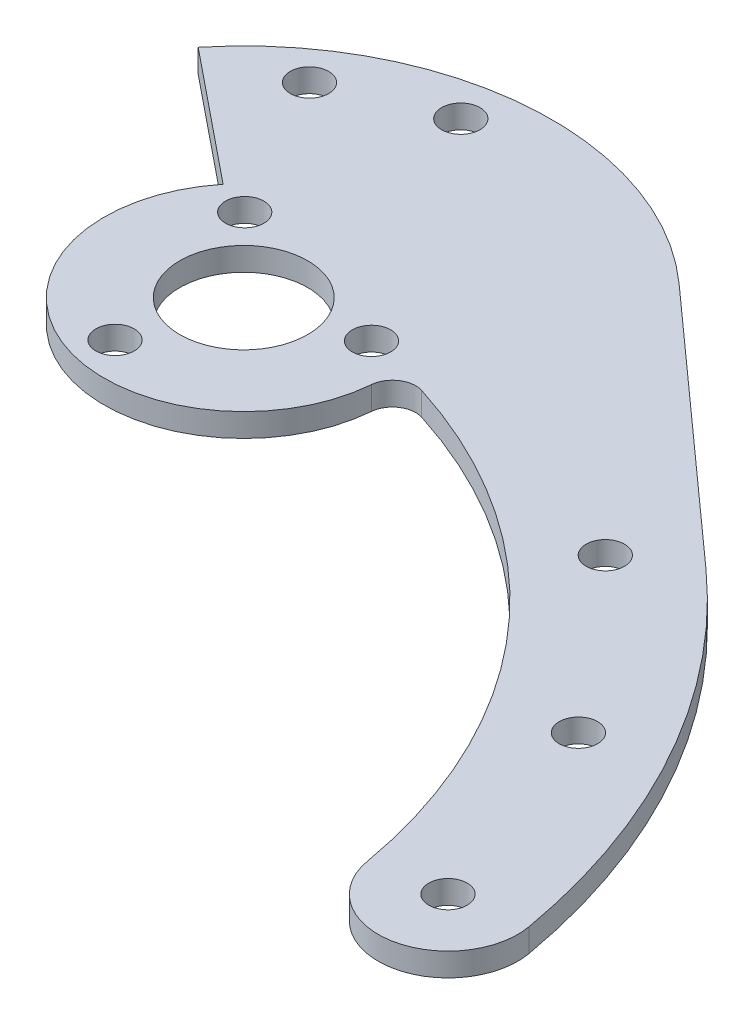
ISO-10303-21;
HEADER;
FILE_DESCRIPTION(('STEP AP214'),'2;1');
FILE_NAME('part.step','',(''),(''),'','','');
FILE_SCHEMA(('AUTOMOTIVE_DESIGN { 1 0 10303 214 1 1 1 1 }'));
ENDSEC;
DATA;
#1=APPLICATION_CONTEXT('core data for automotive mechanical design processes');
#2=APPLICATION_PROTOCOL_DEFINITION('international standard','automotive_design',2000,#1);
#3=PRODUCT_CONTEXT('',#1,'mechanical');
#4=PRODUCT('Part','Part','',(#3));
#5=PRODUCT_RELATED_PRODUCT_CATEGORY('part','',(#4));
#6=PRODUCT_DEFINITION_FORMATION('','',#4);
#7=PRODUCT_DEFINITION_CONTEXT('part definition',#1,'design');
#8=PRODUCT_DEFINITION('design','',#6,#7);
#9=PRODUCT_DEFINITION_SHAPE('','',#8);
#10=(LENGTH_UNIT() NAMED_UNIT(*) SI_UNIT(.MILLI.,.METRE.));
#11=(NAMED_UNIT(*) PLANE_ANGLE_UNIT() SI_UNIT($,.RADIAN.));
#12=(NAMED_UNIT(*) SI_UNIT($,.STERADIAN.) SOLID_ANGLE_UNIT());
#13=UNCERTAINTY_MEASURE_WITH_UNIT(LENGTH_MEASURE(1.E-05),#10,'distance_accuracy_value','');
#14=(GEOMETRIC_REPRESENTATION_CONTEXT(3) GLOBAL_UNCERTAINTY_ASSIGNED_CONTEXT((#13)) GLOBAL_UNIT_ASSIGNED_CONTEXT((#10,
#11,#12)) REPRESENTATION_CONTEXT('',''));
#15=CARTESIAN_POINT('',(0.,0.,0.));
#16=DIRECTION('',(0.,0.,1.));
#17=DIRECTION('',(1.,0.,0.));
#18=AXIS2_PLACEMENT_3D('',#15,#16,#17);
#19=CARTESIAN_POINT('',(0.,2.,0.));
#20=DIRECTION('',(0.,-1.,0.));
#21=DIRECTION('',(0.,0.,-1.));
#22=AXIS2_PLACEMENT_3D('',#19,#20,#21);
#23=PLANE('',#22);
#24=CARTESIAN_POINT('',(34.7105309230729,2.,3.63360007157498));
#25=DIRECTION('',(0.,1.,0.));
#26=DIRECTION('',(0.,0.,1.));
#27=AXIS2_PLACEMENT_3D('',#24,#25,#26);
#28=CIRCLE('',#27,1.65);
#29=CARTESIAN_POINT('',(34.7105309230729,2.,5.28360007157498));
#30=VERTEX_POINT('',#29);
#31=EDGE_CURVE('E379',#30,#30,#28,.T.);
#32=ORIENTED_EDGE('',*,*,#31,.F.);
#33=EDGE_LOOP('',(#32));
#34=FACE_BOUND('',#33,.T.);
#35=CARTESIAN_POINT('',(53.1796186626592,2.,35.6229984059855));
#36=DIRECTION('',(0.,1.,0.));
#37=DIRECTION('',(0.,0.,1.));
#38=AXIS2_PLACEMENT_3D('',#35,#36,#37);
#39=CIRCLE('',#38,1.65);
#40=CARTESIAN_POINT('',(53.1796186626592,2.,37.2729984059855));
#41=VERTEX_POINT('',#40);
#42=EDGE_CURVE('E373',#41,#41,#39,.T.);
#43=ORIENTED_EDGE('',*,*,#42,.F.);
#44=EDGE_LOOP('',(#43));
#45=FACE_BOUND('',#44,.T.);
#46=CARTESIAN_POINT('',(46.7653718043596,2.,17.9999999999998));
#47=DIRECTION('',(0.,1.,0.));
#48=DIRECTION('',(0.,0.,1.));
#49=AXIS2_PLACEMENT_3D('',#46,#47,#48);
#50=CIRCLE('',#49,1.64999999999999);
#51=CARTESIAN_POINT('',(46.7653718043596,2.,19.6499999999998));
#52=VERTEX_POINT('',#51);
#53=EDGE_CURVE('E376',#52,#52,#50,.T.);
#54=ORIENTED_EDGE('',*,*,#53,.F.);
#55=EDGE_LOOP('',(#54));
#56=FACE_BOUND('',#55,.T.);
#57=CARTESIAN_POINT('',(-13.1922580360741,2.,-18.8404970186468));
#58=DIRECTION('',(0.,1.,0.));
#59=DIRECTION('',(0.,0.,-1.));
#60=AXIS2_PLACEMENT_3D('',#57,#58,#59);
#61=CIRCLE('',#60,1.65);
#62=CARTESIAN_POINT('',(-13.1922580360741,2.,-20.4904970186468));
#63=VERTEX_POINT('',#62);
#64=EDGE_CURVE('E388',#63,#63,#61,.T.);
#65=ORIENTED_EDGE('',*,*,#64,.F.);
#66=EDGE_LOOP('',(#65));
#67=FACE_BOUND('',#66,.T.);
#68=CARTESIAN_POINT('',(-3.99390808633942,2.,-22.6505783192808));
#69=DIRECTION('',(0.,1.,0.));
#70=DIRECTION('',(0.,0.,1.));
#71=AXIS2_PLACEMENT_3D('',#68,#69,#70);
#72=CIRCLE('',#71,1.65);
#73=CARTESIAN_POINT('',(-3.99390808633942,2.,-21.0005783192808));
#74=VERTEX_POINT('',#73);
#75=EDGE_CURVE('E387',#74,#74,#72,.T.);
#76=ORIENTED_EDGE('',*,*,#75,.F.);
#77=EDGE_LOOP('',(#76));
#78=FACE_BOUND('',#77,.T.);
#79=CARTESIAN_POINT('',(0.,2.,0.));
#80=DIRECTION('',(0.,1.,0.));
#81=DIRECTION('',(0.,0.,-1.));
#82=AXIS2_PLACEMENT_3D('',#79,#80,#81);
#83=CIRCLE('',#82,26.5);
#84=CARTESIAN_POINT('',(17.6931753318826,2.,-19.728191672712));
#85=VERTEX_POINT('',#84);
#86=CARTESIAN_POINT('',(-20.5943679786096,2.,-16.6769903628208));
#87=VERTEX_POINT('',#86);
#88=EDGE_CURVE('E105',#85,#87,#83,.T.);
#89=ORIENTED_EDGE('',*,*,#88,.T.);
#90=DIRECTION('',(0.777145961456968,0.,0.629320391049841));
#91=VECTOR('',#90,1.);
#92=CARTESIAN_POINT('',(-9.32575153748363,2.,-7.55184469259811));
#93=LINE('',#92,#91);
#94=CARTESIAN_POINT('',(-9.32575153748362,2.,-7.55184469259812));
#95=VERTEX_POINT('',#94);
#96=EDGE_CURVE('E109',#87,#95,#93,.T.);
#97=ORIENTED_EDGE('',*,*,#96,.T.);
#98=CARTESIAN_POINT('',(0.,2.,0.));
#99=DIRECTION('',(0.,1.,0.));
#100=DIRECTION('',(0.,0.,1.));
#101=AXIS2_PLACEMENT_3D('',#98,#99,#100);
#102=CIRCLE('',#101,12.);
#103=CARTESIAN_POINT('',(11.9583266338679,2.,0.999211748192564));
#104=VERTEX_POINT('',#103);
#105=EDGE_CURVE('E129',#95,#104,#102,.T.);
#106=ORIENTED_EDGE('',*,*,#105,.T.);
#107=CARTESIAN_POINT('',(13.9513810728459,2.,1.16574703955799));
#108=DIRECTION('',(0.,-1.,0.));
#109=DIRECTION('',(0.,0.,-1.));
#110=AXIS2_PLACEMENT_3D('',#107,#108,#109);
#111=CIRCLE('',#110,2.);
#112=CARTESIAN_POINT('',(14.5579628586218,2.,-0.740048998103156));
#113=VERTEX_POINT('',#112);
#114=EDGE_CURVE('E11',#104,#113,#111,.T.);
#115=ORIENTED_EDGE('',*,*,#114,.T.);
#116=CARTESIAN_POINT('',(0.,2.,44.9990559057643));
#117=DIRECTION('',(0.,-1.,0.));
#118=DIRECTION('',(0.,0.,1.));
#119=AXIS2_PLACEMENT_3D('',#116,#117,#118);
#120=CIRCLE('',#119,48.);
#121=CARTESIAN_POINT('',(47.270772144586,2.,36.6639433777517));
#122=VERTEX_POINT('',#121);
#123=EDGE_CURVE('E131',#113,#122,#120,.T.);
#124=ORIENTED_EDGE('',*,*,#123,.T.);
#125=CARTESIAN_POINT('',(53.1796186626593,2.,35.6220543117502));
#126=DIRECTION('',(0.,1.,0.));
#127=DIRECTION('',(0.,0.,-1.));
#128=AXIS2_PLACEMENT_3D('',#125,#126,#127);
#129=CIRCLE('',#128,6.);
#130=CARTESIAN_POINT('',(59.0884651807325,2.,34.5801652457486));
#131=VERTEX_POINT('',#130);
#132=EDGE_CURVE('E136',#122,#131,#129,.T.);
#133=ORIENTED_EDGE('',*,*,#132,.T.);
#134=CARTESIAN_POINT('',(0.,2.,44.9990559057643));
#135=DIRECTION('',(0.,1.,0.));
#136=DIRECTION('',(0.,0.,-1.));
#137=AXIS2_PLACEMENT_3D('',#134,#135,#136);
#138=CIRCLE('',#137,60.);
#139=CARTESIAN_POINT('',(40.0600196193567,2.,0.33145211849181));
#140=VERTEX_POINT('',#139);
#141=EDGE_CURVE('E138',#131,#140,#138,.T.);
#142=ORIENTED_EDGE('',*,*,#141,.T.);
#143=DIRECTION('',(-0.744460063121208,0.,-0.667666993655945));
#144=VECTOR('',#143,1.);
#145=CARTESIAN_POINT('',(40.0600196193567,2.,0.33145211849181));
#146=LINE('',#145,#144);
#147=EDGE_CURVE('E112',#140,#85,#146,.T.);
#148=ORIENTED_EDGE('',*,*,#147,.T.);
#149=EDGE_LOOP('',(#89,#97,#106,#115,#124,#133,#142,#148));
#150=FACE_BOUND('',#149,.T.);
#151=CARTESIAN_POINT('',(0.,2.,0.));
#152=DIRECTION('',(0.,1.,0.));
#153=DIRECTION('',(0.,0.,1.));
#154=AXIS2_PLACEMENT_3D('',#151,#152,#153);
#155=CIRCLE('',#154,5.5);
#156=CARTESIAN_POINT('',(0.,2.,5.5));
#157=VERTEX_POINT('',#156);
#158=EDGE_CURVE('E144',#157,#157,#155,.T.);
#159=ORIENTED_EDGE('',*,*,#158,.F.);
#160=EDGE_LOOP('',(#159));
#161=FACE_BOUND('',#160,.T.);
#162=CARTESIAN_POINT('',(-6.32260432068822,2.,-6.40505071049517));
#163=DIRECTION('',(0.,1.,0.));
#164=DIRECTION('',(0.,0.,1.));
#165=AXIS2_PLACEMENT_3D('',#162,#163,#164);
#166=CIRCLE('',#165,1.65);
#167=CARTESIAN_POINT('',(-6.32260432068822,2.,-4.75505071049517));
#168=VERTEX_POINT('',#167);
#169=EDGE_CURVE('E414',#168,#168,#166,.T.);
#170=ORIENTED_EDGE('',*,*,#169,.F.);
#171=EDGE_LOOP('',(#170));
#172=FACE_BOUND('',#171,.T.);
#173=CARTESIAN_POINT('',(8.70823878816048,2.,-2.27301060454571));
#174=DIRECTION('',(0.,1.,0.));
#175=DIRECTION('',(0.,0.,1.));
#176=AXIS2_PLACEMENT_3D('',#173,#174,#175);
#177=CIRCLE('',#176,1.65);
#178=CARTESIAN_POINT('',(8.70823878816048,2.,-0.623010604545705));
#179=VERTEX_POINT('',#178);
#180=EDGE_CURVE('E408',#179,#179,#177,.T.);
#181=ORIENTED_EDGE('',*,*,#180,.F.);
#182=EDGE_LOOP('',(#181));
#183=FACE_BOUND('',#182,.T.);
#184=CARTESIAN_POINT('',(-2.38563446747228,2.,8.67806131504083));
#185=DIRECTION('',(0.,1.,0.));
#186=DIRECTION('',(0.,0.,1.));
#187=AXIS2_PLACEMENT_3D('',#184,#185,#186);
#188=CIRCLE('',#187,1.65);
#189=CARTESIAN_POINT('',(-2.38563446747228,2.,10.3280613150408));
#190=VERTEX_POINT('',#189);
#191=EDGE_CURVE('E402',#190,#190,#188,.T.);
#192=ORIENTED_EDGE('',*,*,#191,.F.);
#193=EDGE_LOOP('',(#192));
#194=FACE_BOUND('',#193,.T.);
#195=ADVANCED_FACE('F41',(#34,#45,#56,#67,#78,#150,#161,#172,#183,#194),#23,.F.);
#196=CARTESIAN_POINT('',(0.,0.,0.));
#197=DIRECTION('',(0.,-1.,0.));
#198=DIRECTION('',(0.,0.,-1.));
#199=AXIS2_PLACEMENT_3D('',#196,#197,#198);
#200=PLANE('',#199);
#201=CARTESIAN_POINT('',(34.7105309230729,0.,3.63360007157498));
#202=DIRECTION('',(0.,1.,0.));
#203=DIRECTION('',(0.,0.,1.));
#204=AXIS2_PLACEMENT_3D('',#201,#202,#203);
#205=CIRCLE('',#204,1.65);
#206=CARTESIAN_POINT('',(34.7105309230729,0.,5.28360007157498));
#207=VERTEX_POINT('',#206);
#208=EDGE_CURVE('E374',#207,#207,#205,.T.);
#209=ORIENTED_EDGE('',*,*,#208,.T.);
#210=EDGE_LOOP('',(#209));
#211=FACE_BOUND('',#210,.T.);
#212=CARTESIAN_POINT('',(53.1796186626592,0.,35.6229984059855));
#213=DIRECTION('',(0.,1.,0.));
#214=DIRECTION('',(0.,0.,1.));
#215=AXIS2_PLACEMENT_3D('',#212,#213,#214);
#216=CIRCLE('',#215,1.65);
#217=CARTESIAN_POINT('',(53.1796186626592,0.,37.2729984059855));
#218=VERTEX_POINT('',#217);
#219=EDGE_CURVE('E370',#218,#218,#216,.T.);
#220=ORIENTED_EDGE('',*,*,#219,.T.);
#221=EDGE_LOOP('',(#220));
#222=FACE_BOUND('',#221,.T.);
#223=CARTESIAN_POINT('',(46.7653718043596,0.,17.9999999999998));
#224=DIRECTION('',(0.,1.,0.));
#225=DIRECTION('',(0.,0.,1.));
#226=AXIS2_PLACEMENT_3D('',#223,#224,#225);
#227=CIRCLE('',#226,1.64999999999999);
#228=CARTESIAN_POINT('',(46.7653718043596,0.,19.6499999999998));
#229=VERTEX_POINT('',#228);
#230=EDGE_CURVE('E391',#229,#229,#227,.T.);
#231=ORIENTED_EDGE('',*,*,#230,.T.);
#232=EDGE_LOOP('',(#231));
#233=FACE_BOUND('',#232,.T.);
#234=CARTESIAN_POINT('',(-13.1922580360741,0.,-18.8404970186468));
#235=DIRECTION('',(0.,1.,0.));
#236=DIRECTION('',(0.,0.,-1.));
#237=AXIS2_PLACEMENT_3D('',#234,#235,#236);
#238=CIRCLE('',#237,1.65);
#239=CARTESIAN_POINT('',(-13.1922580360741,0.,-20.4904970186468));
#240=VERTEX_POINT('',#239);
#241=EDGE_CURVE('E384',#240,#240,#238,.T.);
#242=ORIENTED_EDGE('',*,*,#241,.T.);
#243=EDGE_LOOP('',(#242));
#244=FACE_BOUND('',#243,.T.);
#245=CARTESIAN_POINT('',(-3.99390808633942,0.,-22.6505783192808));
#246=DIRECTION('',(0.,1.,0.));
#247=DIRECTION('',(0.,0.,1.));
#248=AXIS2_PLACEMENT_3D('',#245,#246,#247);
#249=CIRCLE('',#248,1.65);
#250=CARTESIAN_POINT('',(-3.99390808633942,0.,-21.0005783192808));
#251=VERTEX_POINT('',#250);
#252=EDGE_CURVE('E396',#251,#251,#249,.T.);
#253=ORIENTED_EDGE('',*,*,#252,.T.);
#254=EDGE_LOOP('',(#253));
#255=FACE_BOUND('',#254,.T.);
#256=CARTESIAN_POINT('',(8.70823878816048,0.,-2.27301060454571));
#257=DIRECTION('',(0.,1.,0.));
#258=DIRECTION('',(0.,0.,1.));
#259=AXIS2_PLACEMENT_3D('',#256,#257,#258);
#260=CIRCLE('',#259,1.65);
#261=CARTESIAN_POINT('',(8.70823878816048,0.,-0.623010604545705));
#262=VERTEX_POINT('',#261);
#263=EDGE_CURVE('E405',#262,#262,#260,.T.);
#264=ORIENTED_EDGE('',*,*,#263,.T.);
#265=EDGE_LOOP('',(#264));
#266=FACE_BOUND('',#265,.T.);
#267=CARTESIAN_POINT('',(0.,0.,0.));
#268=DIRECTION('',(0.,1.,0.));
#269=DIRECTION('',(0.,0.,1.));
#270=AXIS2_PLACEMENT_3D('',#267,#268,#269);
#271=CIRCLE('',#270,5.5);
#272=CARTESIAN_POINT('',(0.,0.,5.5));
#273=VERTEX_POINT('',#272);
#274=EDGE_CURVE('E417',#273,#273,#271,.T.);
#275=ORIENTED_EDGE('',*,*,#274,.T.);
#276=EDGE_LOOP('',(#275));
#277=FACE_BOUND('',#276,.T.);
#278=CARTESIAN_POINT('',(0.,0.,0.));
#279=DIRECTION('',(0.,1.,0.));
#280=DIRECTION('',(0.,0.,1.));
#281=AXIS2_PLACEMENT_3D('',#278,#279,#280);
#282=CIRCLE('',#281,26.5);
#283=CARTESIAN_POINT('',(17.6931753318826,0.,-19.728191672712));
#284=VERTEX_POINT('',#283);
#285=CARTESIAN_POINT('',(-20.5943679786096,0.,-16.6769903628208));
#286=VERTEX_POINT('',#285);
#287=EDGE_CURVE('E121',#284,#286,#282,.T.);
#288=ORIENTED_EDGE('',*,*,#287,.F.);
#289=DIRECTION('',(-0.744460063121208,0.,-0.667666993655945));
#290=VECTOR('',#289,1.);
#291=CARTESIAN_POINT('',(40.0600196193567,0.,0.33145211849181));
#292=LINE('',#291,#290);
#293=CARTESIAN_POINT('',(40.0600196193567,0.,0.33145211849181));
#294=VERTEX_POINT('',#293);
#295=EDGE_CURVE('E116',#294,#284,#292,.T.);
#296=ORIENTED_EDGE('',*,*,#295,.F.);
#297=CARTESIAN_POINT('',(0.,0.,44.9990559057643));
#298=DIRECTION('',(0.,1.,0.));
#299=DIRECTION('',(0.,0.,-1.));
#300=AXIS2_PLACEMENT_3D('',#297,#298,#299);
#301=CIRCLE('',#300,60.);
#302=CARTESIAN_POINT('',(59.0884651807325,0.,34.5801652457486));
#303=VERTEX_POINT('',#302);
#304=EDGE_CURVE('E152',#303,#294,#301,.T.);
#305=ORIENTED_EDGE('',*,*,#304,.F.);
#306=CARTESIAN_POINT('',(53.1796186626593,0.,35.6220543117502));
#307=DIRECTION('',(0.,1.,0.));
#308=DIRECTION('',(0.,0.,-1.));
#309=AXIS2_PLACEMENT_3D('',#306,#307,#308);
#310=CIRCLE('',#309,6.);
#311=CARTESIAN_POINT('',(47.270772144586,0.,36.6639433777517));
#312=VERTEX_POINT('',#311);
#313=EDGE_CURVE('E150',#312,#303,#310,.T.);
#314=ORIENTED_EDGE('',*,*,#313,.F.);
#315=CARTESIAN_POINT('',(0.,0.,44.9990559057643));
#316=DIRECTION('',(0.,-1.,0.));
#317=DIRECTION('',(0.,0.,1.));
#318=AXIS2_PLACEMENT_3D('',#315,#316,#317);
#319=CIRCLE('',#318,48.);
#320=CARTESIAN_POINT('',(14.5579628586218,0.,-0.740048998103156));
#321=VERTEX_POINT('',#320);
#322=EDGE_CURVE('E148',#321,#312,#319,.T.);
#323=ORIENTED_EDGE('',*,*,#322,.F.);
#324=CARTESIAN_POINT('',(13.9513810728459,0.,1.16574703955799));
#325=DIRECTION('',(0.,-1.,0.));
#326=DIRECTION('',(0.,0.,-1.));
#327=AXIS2_PLACEMENT_3D('',#324,#325,#326);
#328=CIRCLE('',#327,2.);
#329=CARTESIAN_POINT('',(11.9583266338679,0.,0.999211748192564));
#330=VERTEX_POINT('',#329);
#331=EDGE_CURVE('E49',#321,#330,#328,.F.);
#332=ORIENTED_EDGE('',*,*,#331,.T.);
#333=CARTESIAN_POINT('',(0.,0.,0.));
#334=DIRECTION('',(0.,1.,0.));
#335=DIRECTION('',(0.,0.,1.));
#336=AXIS2_PLACEMENT_3D('',#333,#334,#335);
#337=CIRCLE('',#336,12.);
#338=CARTESIAN_POINT('',(-9.32575153748362,0.,-7.55184469259812));
#339=VERTEX_POINT('',#338);
#340=EDGE_CURVE('E146',#339,#330,#337,.T.);
#341=ORIENTED_EDGE('',*,*,#340,.F.);
#342=DIRECTION('',(0.777145961456968,0.,0.629320391049841));
#343=VECTOR('',#342,1.);
#344=CARTESIAN_POINT('',(-9.32575153748363,0.,-7.55184469259811));
#345=LINE('',#344,#343);
#346=EDGE_CURVE('E143',#286,#339,#345,.T.);
#347=ORIENTED_EDGE('',*,*,#346,.F.);
#348=EDGE_LOOP('',(#288,#296,#305,#314,#323,#332,#341,#347));
#349=FACE_BOUND('',#348,.T.);
#350=CARTESIAN_POINT('',(-6.32260432068822,0.,-6.40505071049517));
#351=DIRECTION('',(0.,1.,0.));
#352=DIRECTION('',(0.,0.,1.));
#353=AXIS2_PLACEMENT_3D('',#350,#351,#352);
#354=CIRCLE('',#353,1.65);
#355=CARTESIAN_POINT('',(-6.32260432068822,0.,-4.75505071049517));
#356=VERTEX_POINT('',#355);
#357=EDGE_CURVE('E411',#356,#356,#354,.T.);
#358=ORIENTED_EDGE('',*,*,#357,.T.);
#359=EDGE_LOOP('',(#358));
#360=FACE_BOUND('',#359,.T.);
#361=CARTESIAN_POINT('',(-2.38563446747228,0.,8.67806131504083));
#362=DIRECTION('',(0.,1.,0.));
#363=DIRECTION('',(0.,0.,1.));
#364=AXIS2_PLACEMENT_3D('',#361,#362,#363);
#365=CIRCLE('',#364,1.65);
#366=CARTESIAN_POINT('',(-2.38563446747228,0.,10.3280613150408));
#367=VERTEX_POINT('',#366);
#368=EDGE_CURVE('E399',#367,#367,#365,.T.);
#369=ORIENTED_EDGE('',*,*,#368,.T.);
#370=EDGE_LOOP('',(#369));
#371=FACE_BOUND('',#370,.T.);
#372=ADVANCED_FACE('F177',(#211,#222,#233,#244,#255,#266,#277,#349,#360,#371),#200,.T.);
#373=CARTESIAN_POINT('',(0.,2.,0.));
#374=DIRECTION('',(0.,-1.,0.));
#375=DIRECTION('',(0.,0.,-1.));
#376=AXIS2_PLACEMENT_3D('',#373,#374,#375);
#377=CYLINDRICAL_SURFACE('',#376,26.5);
#378=ORIENTED_EDGE('',*,*,#287,.T.);
#379=DIRECTION('',(0.,-1.,0.));
#380=VECTOR('',#379,1.);
#381=CARTESIAN_POINT('',(-20.5943679786096,2.,-16.6769903628208));
#382=LINE('',#381,#380);
#383=EDGE_CURVE('E119',#87,#286,#382,.T.);
#384=ORIENTED_EDGE('',*,*,#383,.F.);
#385=ORIENTED_EDGE('',*,*,#88,.F.);
#386=DIRECTION('',(0.,-1.,0.));
#387=VECTOR('',#386,1.);
#388=CARTESIAN_POINT('',(17.6931753318826,2.,-19.728191672712));
#389=LINE('',#388,#387);
#390=EDGE_CURVE('E141',#85,#284,#389,.T.);
#391=ORIENTED_EDGE('',*,*,#390,.T.);
#392=EDGE_LOOP('',(#378,#384,#385,#391));
#393=FACE_BOUND('',#392,.T.);
#394=ADVANCED_FACE('F120',(#393),#377,.T.);
#395=CARTESIAN_POINT('',(-9.32575153748363,2.,-7.55184469259811));
#396=DIRECTION('',(0.629320391049841,0.,-0.777145961456968));
#397=DIRECTION('',(-0.777145961456968,0.,-0.629320391049841));
#398=AXIS2_PLACEMENT_3D('',#395,#396,#397);
#399=PLANE('',#398);
#400=ORIENTED_EDGE('',*,*,#346,.T.);
#401=DIRECTION('',(0.,-1.,0.));
#402=VECTOR('',#401,1.);
#403=CARTESIAN_POINT('',(-9.32575153748362,2.,-7.55184469259812));
#404=LINE('',#403,#402);
#405=EDGE_CURVE('E125',#95,#339,#404,.T.);
#406=ORIENTED_EDGE('',*,*,#405,.F.);
#407=ORIENTED_EDGE('',*,*,#96,.F.);
#408=ORIENTED_EDGE('',*,*,#383,.T.);
#409=EDGE_LOOP('',(#400,#406,#407,#408));
#410=FACE_BOUND('',#409,.T.);
#411=ADVANCED_FACE('F127',(#410),#399,.F.);
#412=CARTESIAN_POINT('',(0.,2.,0.));
#413=DIRECTION('',(0.,-1.,0.));
#414=DIRECTION('',(0.,0.,-1.));
#415=AXIS2_PLACEMENT_3D('',#412,#413,#414);
#416=CYLINDRICAL_SURFACE('',#415,12.);
#417=ORIENTED_EDGE('',*,*,#340,.T.);
#418=DIRECTION('',(0.,-1.,0.));
#419=VECTOR('',#418,1.);
#420=CARTESIAN_POINT('',(11.9583266338679,2.,0.999211748192564));
#421=LINE('',#420,#419);
#422=EDGE_CURVE('E56',#330,#104,#421,.F.);
#423=ORIENTED_EDGE('',*,*,#422,.T.);
#424=ORIENTED_EDGE('',*,*,#105,.F.);
#425=ORIENTED_EDGE('',*,*,#405,.T.);
#426=EDGE_LOOP('',(#417,#423,#424,#425));
#427=FACE_BOUND('',#426,.T.);
#428=ADVANCED_FACE('F221',(#427),#416,.T.);
#429=CARTESIAN_POINT('',(0.,2.,44.9990559057643));
#430=DIRECTION('',(0.,-1.,0.));
#431=DIRECTION('',(0.,0.,-1.));
#432=AXIS2_PLACEMENT_3D('',#429,#430,#431);
#433=CYLINDRICAL_SURFACE('',#432,48.);
#434=ORIENTED_EDGE('',*,*,#123,.F.);
#435=DIRECTION('',(0.,-1.,0.));
#436=VECTOR('',#435,1.);
#437=CARTESIAN_POINT('',(14.5579628586218,2.,-0.740048998103163));
#438=LINE('',#437,#436);
#439=EDGE_CURVE('E124',#113,#321,#438,.T.);
#440=ORIENTED_EDGE('',*,*,#439,.T.);
#441=ORIENTED_EDGE('',*,*,#322,.T.);
#442=DIRECTION('',(0.,-1.,0.));
#443=VECTOR('',#442,1.);
#444=CARTESIAN_POINT('',(47.270772144586,2.,36.6639433777517));
#445=LINE('',#444,#443);
#446=EDGE_CURVE('E163',#122,#312,#445,.T.);
#447=ORIENTED_EDGE('',*,*,#446,.F.);
#448=EDGE_LOOP('',(#434,#440,#441,#447));
#449=FACE_BOUND('',#448,.T.);
#450=ADVANCED_FACE('F172',(#449),#433,.F.);
#451=CARTESIAN_POINT('',(53.1796186626593,2.,35.6220543117502));
#452=DIRECTION('',(0.,-1.,0.));
#453=DIRECTION('',(0.,0.,-1.));
#454=AXIS2_PLACEMENT_3D('',#451,#452,#453);
#455=CYLINDRICAL_SURFACE('',#454,6.);
#456=ORIENTED_EDGE('',*,*,#313,.T.);
#457=DIRECTION('',(0.,-1.,0.));
#458=VECTOR('',#457,1.);
#459=CARTESIAN_POINT('',(59.0884651807325,2.,34.5801652457486));
#460=LINE('',#459,#458);
#461=EDGE_CURVE('E160',#131,#303,#460,.T.);
#462=ORIENTED_EDGE('',*,*,#461,.F.);
#463=ORIENTED_EDGE('',*,*,#132,.F.);
#464=ORIENTED_EDGE('',*,*,#446,.T.);
#465=EDGE_LOOP('',(#456,#462,#463,#464));
#466=FACE_BOUND('',#465,.T.);
#467=ADVANCED_FACE('F183',(#466),#455,.T.);
#468=CARTESIAN_POINT('',(0.,2.,44.9990559057643));
#469=DIRECTION('',(0.,-1.,0.));
#470=DIRECTION('',(0.,0.,-1.));
#471=AXIS2_PLACEMENT_3D('',#468,#469,#470);
#472=CYLINDRICAL_SURFACE('',#471,60.);
#473=ORIENTED_EDGE('',*,*,#304,.T.);
#474=DIRECTION('',(0.,-1.,0.));
#475=VECTOR('',#474,1.);
#476=CARTESIAN_POINT('',(40.0600196193567,2.,0.33145211849181));
#477=LINE('',#476,#475);
#478=EDGE_CURVE('E157',#140,#294,#477,.T.);
#479=ORIENTED_EDGE('',*,*,#478,.F.);
#480=ORIENTED_EDGE('',*,*,#141,.F.);
#481=ORIENTED_EDGE('',*,*,#461,.T.);
#482=EDGE_LOOP('',(#473,#479,#480,#481));
#483=FACE_BOUND('',#482,.T.);
#484=ADVANCED_FACE('F187',(#483),#472,.T.);
#485=CARTESIAN_POINT('',(40.0600196193567,2.,0.33145211849181));
#486=DIRECTION('',(-0.667666993655945,0.,0.744460063121208));
#487=DIRECTION('',(0.744460063121208,0.,0.667666993655945));
#488=AXIS2_PLACEMENT_3D('',#485,#486,#487);
#489=PLANE('',#488);
#490=ORIENTED_EDGE('',*,*,#295,.T.);
#491=ORIENTED_EDGE('',*,*,#390,.F.);
#492=ORIENTED_EDGE('',*,*,#147,.F.);
#493=ORIENTED_EDGE('',*,*,#478,.T.);
#494=EDGE_LOOP('',(#490,#491,#492,#493));
#495=FACE_BOUND('',#494,.T.);
#496=ADVANCED_FACE('F211',(#495),#489,.F.);
#497=CARTESIAN_POINT('',(0.,2.,0.));
#498=DIRECTION('',(0.,-1.,0.));
#499=DIRECTION('',(0.,0.,-1.));
#500=AXIS2_PLACEMENT_3D('',#497,#498,#499);
#501=CYLINDRICAL_SURFACE('',#500,5.5);
#502=ORIENTED_EDGE('',*,*,#158,.T.);
#503=EDGE_LOOP('',(#502));
#504=FACE_BOUND('',#503,.T.);
#505=ORIENTED_EDGE('',*,*,#274,.F.);
#506=EDGE_LOOP('',(#505));
#507=FACE_BOUND('',#506,.T.);
#508=ADVANCED_FACE('F208',(#504,#507),#501,.F.);
#509=CARTESIAN_POINT('',(-6.32260432068822,2.,-6.40505071049517));
#510=DIRECTION('',(0.,-1.,0.));
#511=DIRECTION('',(0.,0.,-1.));
#512=AXIS2_PLACEMENT_3D('',#509,#510,#511);
#513=CYLINDRICAL_SURFACE('',#512,1.65);
#514=ORIENTED_EDGE('',*,*,#169,.T.);
#515=EDGE_LOOP('',(#514));
#516=FACE_BOUND('',#515,.T.);
#517=ORIENTED_EDGE('',*,*,#357,.F.);
#518=EDGE_LOOP('',(#517));
#519=FACE_BOUND('',#518,.T.);
#520=ADVANCED_FACE('F260',(#516,#519),#513,.F.);
#521=CARTESIAN_POINT('',(8.70823878816048,2.,-2.27301060454571));
#522=DIRECTION('',(0.,-1.,0.));
#523=DIRECTION('',(0.,0.,-1.));
#524=AXIS2_PLACEMENT_3D('',#521,#522,#523);
#525=CYLINDRICAL_SURFACE('',#524,1.65);
#526=ORIENTED_EDGE('',*,*,#180,.T.);
#527=EDGE_LOOP('',(#526));
#528=FACE_BOUND('',#527,.T.);
#529=ORIENTED_EDGE('',*,*,#263,.F.);
#530=EDGE_LOOP('',(#529));
#531=FACE_BOUND('',#530,.T.);
#532=ADVANCED_FACE('F267',(#528,#531),#525,.F.);
#533=CARTESIAN_POINT('',(-2.38563446747228,2.,8.67806131504083));
#534=DIRECTION('',(0.,-1.,0.));
#535=DIRECTION('',(0.,0.,-1.));
#536=AXIS2_PLACEMENT_3D('',#533,#534,#535);
#537=CYLINDRICAL_SURFACE('',#536,1.65);
#538=ORIENTED_EDGE('',*,*,#191,.T.);
#539=EDGE_LOOP('',(#538));
#540=FACE_BOUND('',#539,.T.);
#541=ORIENTED_EDGE('',*,*,#368,.F.);
#542=EDGE_LOOP('',(#541));
#543=FACE_BOUND('',#542,.T.);
#544=ADVANCED_FACE('F274',(#540,#543),#537,.F.);
#545=CARTESIAN_POINT('',(-3.99390808633942,0.,-22.6505783192808));
#546=DIRECTION('',(0.,1.,0.));
#547=DIRECTION('',(0.,0.,1.));
#548=AXIS2_PLACEMENT_3D('',#545,#546,#547);
#549=CYLINDRICAL_SURFACE('',#548,1.65);
#550=ORIENTED_EDGE('',*,*,#252,.F.);
#551=EDGE_LOOP('',(#550));
#552=FACE_BOUND('',#551,.T.);
#553=ORIENTED_EDGE('',*,*,#75,.T.);
#554=EDGE_LOOP('',(#553));
#555=FACE_BOUND('',#554,.T.);
#556=ADVANCED_FACE('F282',(#552,#555),#549,.F.);
#557=CARTESIAN_POINT('',(-13.1922580360741,0.,-18.8404970186468));
#558=DIRECTION('',(0.,1.,0.));
#559=DIRECTION('',(0.,0.,1.));
#560=AXIS2_PLACEMENT_3D('',#557,#558,#559);
#561=CYLINDRICAL_SURFACE('',#560,1.65);
#562=ORIENTED_EDGE('',*,*,#241,.F.);
#563=EDGE_LOOP('',(#562));
#564=FACE_BOUND('',#563,.T.);
#565=ORIENTED_EDGE('',*,*,#64,.T.);
#566=EDGE_LOOP('',(#565));
#567=FACE_BOUND('',#566,.T.);
#568=ADVANCED_FACE('F290',(#564,#567),#561,.F.);
#569=CARTESIAN_POINT('',(46.7653718043596,0.,17.9999999999998));
#570=DIRECTION('',(0.,1.,0.));
#571=DIRECTION('',(0.,0.,1.));
#572=AXIS2_PLACEMENT_3D('',#569,#570,#571);
#573=CYLINDRICAL_SURFACE('',#572,1.64999999999999);
#574=ORIENTED_EDGE('',*,*,#230,.F.);
#575=EDGE_LOOP('',(#574));
#576=FACE_BOUND('',#575,.T.);
#577=ORIENTED_EDGE('',*,*,#53,.T.);
#578=EDGE_LOOP('',(#577));
#579=FACE_BOUND('',#578,.T.);
#580=ADVANCED_FACE('F298',(#576,#579),#573,.F.);
#581=CARTESIAN_POINT('',(53.1796186626592,0.,35.6229984059855));
#582=DIRECTION('',(0.,1.,0.));
#583=DIRECTION('',(0.,0.,1.));
#584=AXIS2_PLACEMENT_3D('',#581,#582,#583);
#585=CYLINDRICAL_SURFACE('',#584,1.65);
#586=ORIENTED_EDGE('',*,*,#219,.F.);
#587=EDGE_LOOP('',(#586));
#588=FACE_BOUND('',#587,.T.);
#589=ORIENTED_EDGE('',*,*,#42,.T.);
#590=EDGE_LOOP('',(#589));
#591=FACE_BOUND('',#590,.T.);
#592=ADVANCED_FACE('F194',(#588,#591),#585,.F.);
#593=CARTESIAN_POINT('',(34.7105309230729,0.,3.63360007157498));
#594=DIRECTION('',(0.,1.,0.));
#595=DIRECTION('',(0.,0.,1.));
#596=AXIS2_PLACEMENT_3D('',#593,#594,#595);
#597=CYLINDRICAL_SURFACE('',#596,1.65);
#598=ORIENTED_EDGE('',*,*,#208,.F.);
#599=EDGE_LOOP('',(#598));
#600=FACE_BOUND('',#599,.T.);
#601=ORIENTED_EDGE('',*,*,#31,.T.);
#602=EDGE_LOOP('',(#601));
#603=FACE_BOUND('',#602,.T.);
#604=ADVANCED_FACE('F190',(#600,#603),#597,.F.);
#605=CARTESIAN_POINT('',(13.9513810728459,2.,1.16574703955799));
#606=DIRECTION('',(0.,-1.,0.));
#607=DIRECTION('',(0.,0.,-1.));
#608=AXIS2_PLACEMENT_3D('',#605,#606,#607);
#609=CYLINDRICAL_SURFACE('',#608,2.);
#610=ORIENTED_EDGE('',*,*,#114,.F.);
#611=ORIENTED_EDGE('',*,*,#422,.F.);
#612=ORIENTED_EDGE('',*,*,#331,.F.);
#613=ORIENTED_EDGE('',*,*,#439,.F.);
#614=EDGE_LOOP('',(#610,#611,#612,#613));
#615=FACE_BOUND('',#614,.T.);
#616=ADVANCED_FACE('F43',(#615),#609,.F.);
#617=CLOSED_SHELL('',(#195,#372,#394,#411,#428,#450,#467,#484,#496,#508,#520,#532,#544,#556,
#568,#580,#592,#604,#616));
#618=MANIFOLD_SOLID_BREP('B2',#617);
#619=ADVANCED_BREP_SHAPE_REPRESENTATION('',(#18,#618),#14);
#620=SHAPE_DEFINITION_REPRESENTATION(#9,#619);
ENDSEC;
END-ISO-10303-21;
